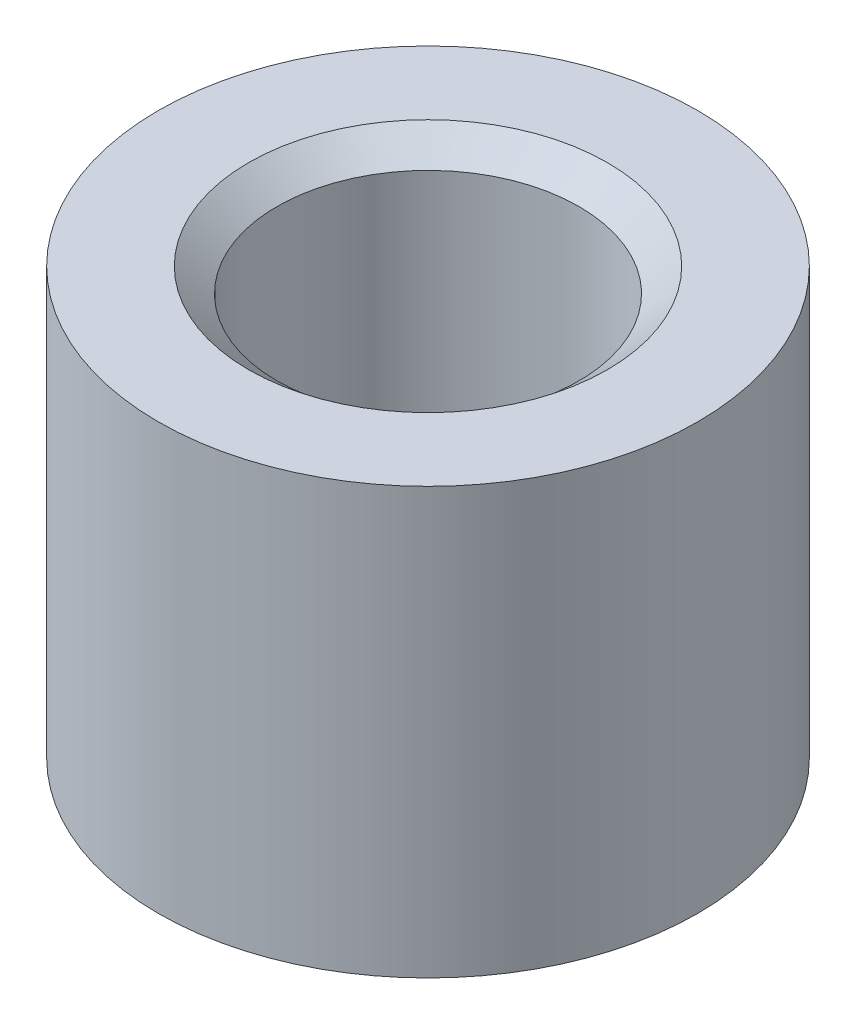
ISO-10303-21;
HEADER;
FILE_DESCRIPTION(('STEP AP214'),'2;1');
FILE_NAME('part.step','',(''),(''),'','','');
FILE_SCHEMA(('AUTOMOTIVE_DESIGN { 1 0 10303 214 1 1 1 1 }'));
ENDSEC;
DATA;
#1=APPLICATION_CONTEXT('core data for automotive mechanical design processes');
#2=APPLICATION_PROTOCOL_DEFINITION('international standard','automotive_design',2000,#1);
#3=PRODUCT_CONTEXT('',#1,'mechanical');
#4=PRODUCT('Part','Part','',(#3));
#5=PRODUCT_RELATED_PRODUCT_CATEGORY('part','',(#4));
#6=PRODUCT_DEFINITION_FORMATION('','',#4);
#7=PRODUCT_DEFINITION_CONTEXT('part definition',#1,'design');
#8=PRODUCT_DEFINITION('design','',#6,#7);
#9=PRODUCT_DEFINITION_SHAPE('','',#8);
#10=(LENGTH_UNIT() NAMED_UNIT(*) SI_UNIT(.MILLI.,.METRE.));
#11=(NAMED_UNIT(*) PLANE_ANGLE_UNIT() SI_UNIT($,.RADIAN.));
#12=(NAMED_UNIT(*) SI_UNIT($,.STERADIAN.) SOLID_ANGLE_UNIT());
#13=UNCERTAINTY_MEASURE_WITH_UNIT(LENGTH_MEASURE(1.E-05),#10,'distance_accuracy_value','');
#14=(GEOMETRIC_REPRESENTATION_CONTEXT(3) GLOBAL_UNCERTAINTY_ASSIGNED_CONTEXT((#13)) GLOBAL_UNIT_ASSIGNED_CONTEXT((#10,
#11,#12)) REPRESENTATION_CONTEXT('',''));
#15=CARTESIAN_POINT('',(0.,0.,0.));
#16=DIRECTION('',(0.,0.,1.));
#17=DIRECTION('',(1.,0.,0.));
#18=AXIS2_PLACEMENT_3D('',#15,#16,#17);
#19=CARTESIAN_POINT('',(0.,9.525,0.));
#20=DIRECTION('',(0.,-1.,0.));
#21=DIRECTION('',(0.,0.,-1.));
#22=AXIS2_PLACEMENT_3D('',#19,#20,#21);
#23=CYLINDRICAL_SURFACE('',#22,6.0325);
#24=CARTESIAN_POINT('',(0.,9.525,0.));
#25=DIRECTION('',(0.,1.,0.));
#26=DIRECTION('',(0.,0.,1.));
#27=AXIS2_PLACEMENT_3D('',#24,#25,#26);
#28=CIRCLE('',#27,6.0325);
#29=CARTESIAN_POINT('',(0.,9.525,-6.0325));
#30=VERTEX_POINT('',#29);
#31=EDGE_CURVE('E10',#30,#30,#28,.T.);
#32=CARTESIAN_POINT('',(0.,0.,0.));
#33=DIRECTION('',(0.,1.,0.));
#34=DIRECTION('',(0.,0.,1.));
#35=AXIS2_PLACEMENT_3D('',#32,#33,#34);
#36=CIRCLE('',#35,6.0325);
#37=CARTESIAN_POINT('',(0.,0.,-6.0325));
#38=VERTEX_POINT('',#37);
#39=EDGE_CURVE('E44',#38,#38,#36,.T.);
#40=CARTESIAN_POINT('',(0.,9.525,-6.0325));
#41=CARTESIAN_POINT('',(0.,9.42578125,-6.0325));
#42=CARTESIAN_POINT('',(0.,9.3265625,-6.0325));
#43=CARTESIAN_POINT('',(0.,9.128125,-6.0325));
#44=CARTESIAN_POINT('',(0.,9.02890625,-6.0325));
#45=CARTESIAN_POINT('',(0.,8.83046875,-6.0325));
#46=CARTESIAN_POINT('',(0.,8.73125,-6.0325));
#47=CARTESIAN_POINT('',(0.,8.5328125,-6.0325));
#48=CARTESIAN_POINT('',(0.,8.43359375,-6.0325));
#49=CARTESIAN_POINT('',(0.,8.23515625,-6.0325));
#50=CARTESIAN_POINT('',(0.,8.1359375,-6.0325));
#51=CARTESIAN_POINT('',(0.,7.9375,-6.0325));
#52=CARTESIAN_POINT('',(0.,7.83828125,-6.0325));
#53=CARTESIAN_POINT('',(0.,7.63984375,-6.0325));
#54=CARTESIAN_POINT('',(0.,7.540625,-6.0325));
#55=CARTESIAN_POINT('',(0.,7.3421875,-6.0325));
#56=CARTESIAN_POINT('',(0.,7.24296875,-6.0325));
#57=CARTESIAN_POINT('',(0.,7.04453125,-6.0325));
#58=CARTESIAN_POINT('',(0.,6.9453125,-6.0325));
#59=CARTESIAN_POINT('',(0.,6.746875,-6.0325));
#60=CARTESIAN_POINT('',(0.,6.64765625,-6.0325));
#61=CARTESIAN_POINT('',(0.,6.44921875,-6.0325));
#62=CARTESIAN_POINT('',(0.,6.35,-6.0325));
#63=CARTESIAN_POINT('',(0.,6.1515625,-6.0325));
#64=CARTESIAN_POINT('',(0.,6.05234375,-6.0325));
#65=CARTESIAN_POINT('',(0.,5.85390625,-6.0325));
#66=CARTESIAN_POINT('',(0.,5.7546875,-6.0325));
#67=CARTESIAN_POINT('',(0.,5.55625,-6.0325));
#68=CARTESIAN_POINT('',(0.,5.45703125,-6.0325));
#69=CARTESIAN_POINT('',(0.,5.25859375,-6.0325));
#70=CARTESIAN_POINT('',(0.,5.159375,-6.0325));
#71=CARTESIAN_POINT('',(0.,4.9609375,-6.0325));
#72=CARTESIAN_POINT('',(0.,4.86171875,-6.0325));
#73=CARTESIAN_POINT('',(0.,4.66328125,-6.0325));
#74=CARTESIAN_POINT('',(0.,4.5640625,-6.0325));
#75=CARTESIAN_POINT('',(0.,4.365625,-6.0325));
#76=CARTESIAN_POINT('',(0.,4.26640625,-6.0325));
#77=CARTESIAN_POINT('',(0.,4.06796875,-6.0325));
#78=CARTESIAN_POINT('',(0.,3.96875,-6.0325));
#79=CARTESIAN_POINT('',(0.,3.7703125,-6.0325));
#80=CARTESIAN_POINT('',(0.,3.67109375,-6.0325));
#81=CARTESIAN_POINT('',(0.,3.47265625,-6.0325));
#82=CARTESIAN_POINT('',(0.,3.3734375,-6.0325));
#83=CARTESIAN_POINT('',(0.,3.175,-6.0325));
#84=CARTESIAN_POINT('',(0.,3.07578125,-6.0325));
#85=CARTESIAN_POINT('',(0.,2.87734375,-6.0325));
#86=CARTESIAN_POINT('',(0.,2.778125,-6.0325));
#87=CARTESIAN_POINT('',(0.,2.5796875,-6.0325));
#88=CARTESIAN_POINT('',(0.,2.48046875,-6.0325));
#89=CARTESIAN_POINT('',(0.,2.28203125,-6.0325));
#90=CARTESIAN_POINT('',(0.,2.1828125,-6.0325));
#91=CARTESIAN_POINT('',(0.,1.984375,-6.0325));
#92=CARTESIAN_POINT('',(0.,1.88515625,-6.0325));
#93=CARTESIAN_POINT('',(0.,1.68671875,-6.0325));
#94=CARTESIAN_POINT('',(0.,1.5875,-6.0325));
#95=CARTESIAN_POINT('',(0.,1.3890625,-6.0325));
#96=CARTESIAN_POINT('',(0.,1.28984375,-6.0325));
#97=CARTESIAN_POINT('',(0.,1.09140625,-6.0325));
#98=CARTESIAN_POINT('',(0.,0.992187500000001,-6.0325));
#99=CARTESIAN_POINT('',(0.,0.793750000000001,-6.0325));
#100=CARTESIAN_POINT('',(0.,0.69453125,-6.0325));
#101=CARTESIAN_POINT('',(0.,0.49609375,-6.0325));
#102=CARTESIAN_POINT('',(0.,0.396875,-6.0325));
#103=CARTESIAN_POINT('',(0.,0.1984375,-6.0325));
#104=CARTESIAN_POINT('',(0.,0.0992187500000001,-6.0325));
#105=CARTESIAN_POINT('',(0.,0.,-6.0325));
#106=B_SPLINE_CURVE_WITH_KNOTS('',3,(#40,#41,#42,#43,#44,#45,#46,#47,#48,#49,#50,#51,#52,#53,
#54,#55,#56,#57,#58,#59,#60,#61,#62,#63,#64,#65,#66,#67,#68,#69,#70,#71,#72,#73,#74,#75,#76,#77,
#78,#79,#80,#81,#82,#83,#84,#85,#86,#87,#88,#89,#90,#91,#92,#93,#94,#95,#96,#97,#98,#99,#100,
#101,#102,#103,#104,#105),.UNSPECIFIED.,.F.,.F.,(4,2,2,2,2,2,2,2,2,2,2,2,2,2,2,2,2,2,2,2,2,2,2,
2,2,2,2,2,2,2,2,2,4),(0.,0.29765625,0.5953125,0.892968750000001,1.190625,1.48828125,1.7859375,
2.08359375,2.38125,2.67890625,2.9765625,3.27421875,3.571875,3.86953125,4.1671875,4.46484375,
4.7625,5.06015625,5.3578125,5.65546875,5.953125,6.25078125,6.5484375,6.84609375,7.14375,
7.44140625,7.7390625,8.03671875,8.334375,8.63203125,8.9296875,9.22734375,9.525),.UNSPECIFIED.);
#107=EDGE_CURVE('BSEAM41',#30,#38,#106,.T.);
#108=ORIENTED_EDGE('',*,*,#31,.F.);
#109=ORIENTED_EDGE('',*,*,#39,.T.);
#110=ORIENTED_EDGE('',*,*,#107,.T.);
#111=ORIENTED_EDGE('',*,*,#107,.F.);
#112=EDGE_LOOP('',(#108,#110,#109,#111));
#113=FACE_BOUND('',#112,.T.);
#114=ADVANCED_FACE('F41',(#113),#23,.T.);
#115=CARTESIAN_POINT('',(0.,9.525,0.));
#116=DIRECTION('',(0.,1.,0.));
#117=DIRECTION('',(0.,0.,1.));
#118=AXIS2_PLACEMENT_3D('',#115,#116,#117);
#119=PLANE('',#118);
#120=CARTESIAN_POINT('',(0.,9.525,0.));
#121=DIRECTION('',(0.,1.,0.));
#122=DIRECTION('',(0.,0.,1.));
#123=AXIS2_PLACEMENT_3D('',#120,#121,#122);
#124=CIRCLE('',#123,4.0132);
#125=CARTESIAN_POINT('',(0.,9.525,4.0132));
#126=VERTEX_POINT('',#125);
#127=EDGE_CURVE('E62',#126,#126,#124,.T.);
#128=ORIENTED_EDGE('',*,*,#127,.F.);
#129=EDGE_LOOP('',(#128));
#130=FACE_BOUND('',#129,.T.);
#131=ORIENTED_EDGE('',*,*,#31,.T.);
#132=EDGE_LOOP('',(#131));
#133=FACE_BOUND('',#132,.T.);
#134=ADVANCED_FACE('F69',(#130,#133),#119,.T.);
#135=CARTESIAN_POINT('',(0.,0.,0.));
#136=DIRECTION('',(0.,1.,0.));
#137=DIRECTION('',(0.,0.,1.));
#138=AXIS2_PLACEMENT_3D('',#135,#136,#137);
#139=PLANE('',#138);
#140=CARTESIAN_POINT('',(0.,0.,0.));
#141=DIRECTION('',(0.,1.,0.));
#142=DIRECTION('',(0.,0.,1.));
#143=AXIS2_PLACEMENT_3D('',#140,#141,#142);
#144=CIRCLE('',#143,3.3782);
#145=CARTESIAN_POINT('',(0.,0.,3.3782));
#146=VERTEX_POINT('',#145);
#147=EDGE_CURVE('E53',#146,#146,#144,.T.);
#148=ORIENTED_EDGE('',*,*,#147,.T.);
#149=EDGE_LOOP('',(#148));
#150=FACE_BOUND('',#149,.T.);
#151=ORIENTED_EDGE('',*,*,#39,.F.);
#152=EDGE_LOOP('',(#151));
#153=FACE_BOUND('',#152,.T.);
#154=ADVANCED_FACE('F71',(#150,#153),#139,.F.);
#155=CARTESIAN_POINT('',(0.,9.525,0.));
#156=DIRECTION('',(0.,1.,0.));
#157=DIRECTION('',(0.,0.,1.));
#158=AXIS2_PLACEMENT_3D('',#155,#156,#157);
#159=CYLINDRICAL_SURFACE('',#158,3.3782);
#160=ORIENTED_EDGE('',*,*,#147,.F.);
#161=EDGE_LOOP('',(#160));
#162=FACE_BOUND('',#161,.T.);
#163=CARTESIAN_POINT('',(0.,8.99217173420243,0.));
#164=DIRECTION('',(0.,1.,0.));
#165=DIRECTION('',(0.,0.,1.));
#166=AXIS2_PLACEMENT_3D('',#163,#164,#165);
#167=CIRCLE('',#166,3.3782);
#168=CARTESIAN_POINT('',(0.,8.99217173420243,3.3782));
#169=VERTEX_POINT('',#168);
#170=EDGE_CURVE('E58',#169,#169,#167,.T.);
#171=ORIENTED_EDGE('',*,*,#170,.T.);
#172=EDGE_LOOP('',(#171));
#173=FACE_BOUND('',#172,.T.);
#174=ADVANCED_FACE('F77',(#162,#173),#159,.F.);
#175=CARTESIAN_POINT('',(0.,9.525,0.));
#176=DIRECTION('',(0.,1.,0.));
#177=DIRECTION('',(0.,0.,1.));
#178=AXIS2_PLACEMENT_3D('',#175,#176,#177);
#179=CONICAL_SURFACE('',#178,4.0132,0.872664625997164);
#180=ORIENTED_EDGE('',*,*,#170,.F.);
#181=EDGE_LOOP('',(#180));
#182=FACE_BOUND('',#181,.T.);
#183=ORIENTED_EDGE('',*,*,#127,.T.);
#184=EDGE_LOOP('',(#183));
#185=FACE_BOUND('',#184,.T.);
#186=ADVANCED_FACE('F67',(#182,#185),#179,.F.);
#187=CLOSED_SHELL('',(#114,#134,#154,#174,#186));
#188=MANIFOLD_SOLID_BREP('B2',#187);
#189=ADVANCED_BREP_SHAPE_REPRESENTATION('',(#18,#188),#14);
#190=SHAPE_DEFINITION_REPRESENTATION(#9,#189);
ENDSEC;
END-ISO-10303-21;
